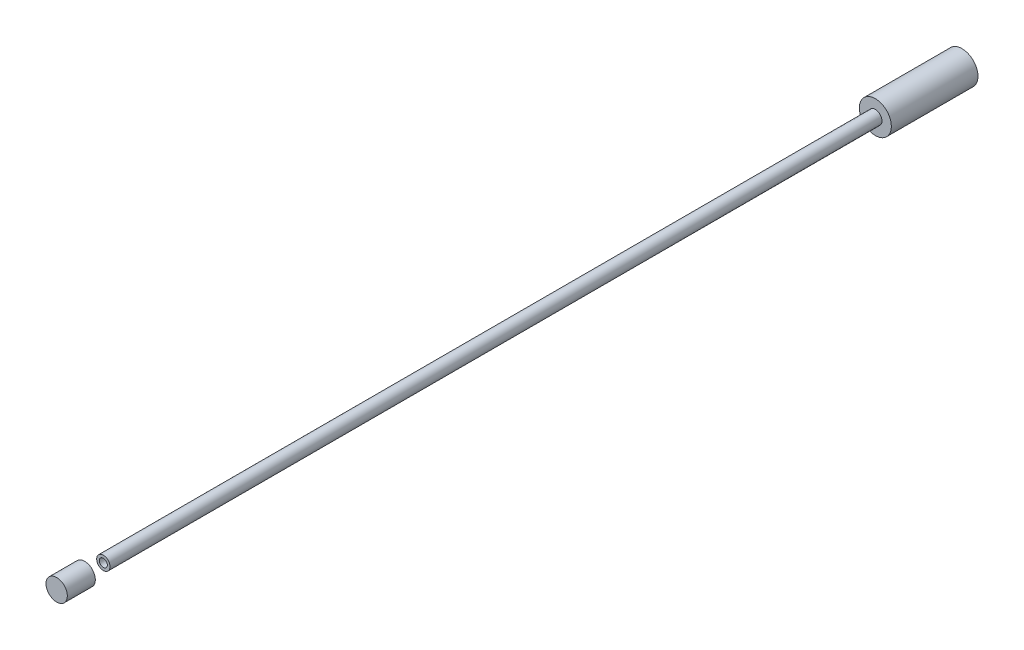
ISO-10303-21;
HEADER;
FILE_DESCRIPTION(('STEP AP214'),'2;1');
FILE_NAME('part.step','',(''),(''),'','','');
FILE_SCHEMA(('AUTOMOTIVE_DESIGN { 1 0 10303 214 1 1 1 1 }'));
ENDSEC;
DATA;
#1=APPLICATION_CONTEXT('core data for automotive mechanical design processes');
#2=APPLICATION_PROTOCOL_DEFINITION('international standard','automotive_design',2000,#1);
#3=PRODUCT_CONTEXT('',#1,'mechanical');
#4=PRODUCT('Part','Part','',(#3));
#5=PRODUCT_RELATED_PRODUCT_CATEGORY('part','',(#4));
#6=PRODUCT_DEFINITION_FORMATION('','',#4);
#7=PRODUCT_DEFINITION_CONTEXT('part definition',#1,'design');
#8=PRODUCT_DEFINITION('design','',#6,#7);
#9=PRODUCT_DEFINITION_SHAPE('','',#8);
#10=(LENGTH_UNIT() NAMED_UNIT(*) SI_UNIT(.MILLI.,.METRE.));
#11=(NAMED_UNIT(*) PLANE_ANGLE_UNIT() SI_UNIT($,.RADIAN.));
#12=(NAMED_UNIT(*) SI_UNIT($,.STERADIAN.) SOLID_ANGLE_UNIT());
#13=UNCERTAINTY_MEASURE_WITH_UNIT(LENGTH_MEASURE(1.E-05),#10,'distance_accuracy_value','');
#14=(GEOMETRIC_REPRESENTATION_CONTEXT(3) GLOBAL_UNCERTAINTY_ASSIGNED_CONTEXT((#13)) GLOBAL_UNIT_ASSIGNED_CONTEXT((#10,
#11,#12)) REPRESENTATION_CONTEXT('',''));
#15=CARTESIAN_POINT('',(0.,0.,0.));
#16=DIRECTION('',(0.,0.,1.));
#17=DIRECTION('',(1.,0.,0.));
#18=AXIS2_PLACEMENT_3D('',#15,#16,#17);
#19=CARTESIAN_POINT('',(285.,0.,344.));
#20=DIRECTION('',(0.,0.,-1.));
#21=DIRECTION('',(-1.,0.,0.));
#22=AXIS2_PLACEMENT_3D('',#19,#20,#21);
#23=CYLINDRICAL_SURFACE('',#22,8.00000000000001);
#24=CARTESIAN_POINT('',(285.,0.,344.));
#25=DIRECTION('',(0.,0.,1.));
#26=DIRECTION('',(1.,0.,0.));
#27=AXIS2_PLACEMENT_3D('',#24,#25,#26);
#28=CIRCLE('',#27,8.00000000000001);
#29=CARTESIAN_POINT('',(277.,0.,344.));
#30=VERTEX_POINT('',#29);
#31=EDGE_CURVE('E11',#30,#30,#28,.T.);
#32=CARTESIAN_POINT('',(285.,0.,323.));
#33=DIRECTION('',(0.,0.,1.));
#34=DIRECTION('',(1.,0.,0.));
#35=AXIS2_PLACEMENT_3D('',#32,#33,#34);
#36=CIRCLE('',#35,8.00000000000001);
#37=CARTESIAN_POINT('',(277.,0.,323.));
#38=VERTEX_POINT('',#37);
#39=EDGE_CURVE('E51',#38,#38,#36,.T.);
#40=CARTESIAN_POINT('',(277.,0.,344.));
#41=CARTESIAN_POINT('',(277.,0.,343.78125));
#42=CARTESIAN_POINT('',(277.,0.,343.5625));
#43=CARTESIAN_POINT('',(277.,0.,343.125));
#44=CARTESIAN_POINT('',(277.,0.,342.90625));
#45=CARTESIAN_POINT('',(277.,0.,342.46875));
#46=CARTESIAN_POINT('',(277.,0.,342.25));
#47=CARTESIAN_POINT('',(277.,0.,341.8125));
#48=CARTESIAN_POINT('',(277.,0.,341.59375));
#49=CARTESIAN_POINT('',(277.,0.,341.15625));
#50=CARTESIAN_POINT('',(277.,0.,340.9375));
#51=CARTESIAN_POINT('',(277.,0.,340.5));
#52=CARTESIAN_POINT('',(277.,0.,340.28125));
#53=CARTESIAN_POINT('',(277.,0.,339.84375));
#54=CARTESIAN_POINT('',(277.,0.,339.625));
#55=CARTESIAN_POINT('',(277.,0.,339.1875));
#56=CARTESIAN_POINT('',(277.,0.,338.96875));
#57=CARTESIAN_POINT('',(277.,0.,338.53125));
#58=CARTESIAN_POINT('',(277.,0.,338.3125));
#59=CARTESIAN_POINT('',(277.,0.,337.875));
#60=CARTESIAN_POINT('',(277.,0.,337.65625));
#61=CARTESIAN_POINT('',(277.,0.,337.21875));
#62=CARTESIAN_POINT('',(277.,0.,337.));
#63=CARTESIAN_POINT('',(277.,0.,336.5625));
#64=CARTESIAN_POINT('',(277.,0.,336.34375));
#65=CARTESIAN_POINT('',(277.,0.,335.90625));
#66=CARTESIAN_POINT('',(277.,0.,335.6875));
#67=CARTESIAN_POINT('',(277.,0.,335.25));
#68=CARTESIAN_POINT('',(277.,0.,335.03125));
#69=CARTESIAN_POINT('',(277.,0.,334.59375));
#70=CARTESIAN_POINT('',(277.,0.,334.375));
#71=CARTESIAN_POINT('',(277.,0.,333.9375));
#72=CARTESIAN_POINT('',(277.,0.,333.71875));
#73=CARTESIAN_POINT('',(277.,0.,333.28125));
#74=CARTESIAN_POINT('',(277.,0.,333.0625));
#75=CARTESIAN_POINT('',(277.,0.,332.625));
#76=CARTESIAN_POINT('',(277.,0.,332.40625));
#77=CARTESIAN_POINT('',(277.,0.,331.96875));
#78=CARTESIAN_POINT('',(277.,0.,331.75));
#79=CARTESIAN_POINT('',(277.,0.,331.3125));
#80=CARTESIAN_POINT('',(277.,0.,331.09375));
#81=CARTESIAN_POINT('',(277.,0.,330.65625));
#82=CARTESIAN_POINT('',(277.,0.,330.4375));
#83=CARTESIAN_POINT('',(277.,0.,330.));
#84=CARTESIAN_POINT('',(277.,0.,329.78125));
#85=CARTESIAN_POINT('',(277.,0.,329.34375));
#86=CARTESIAN_POINT('',(277.,0.,329.125));
#87=CARTESIAN_POINT('',(277.,0.,328.6875));
#88=CARTESIAN_POINT('',(277.,0.,328.46875));
#89=CARTESIAN_POINT('',(277.,0.,328.03125));
#90=CARTESIAN_POINT('',(277.,0.,327.8125));
#91=CARTESIAN_POINT('',(277.,0.,327.375));
#92=CARTESIAN_POINT('',(277.,0.,327.15625));
#93=CARTESIAN_POINT('',(277.,0.,326.71875));
#94=CARTESIAN_POINT('',(277.,0.,326.5));
#95=CARTESIAN_POINT('',(277.,0.,326.0625));
#96=CARTESIAN_POINT('',(277.,0.,325.84375));
#97=CARTESIAN_POINT('',(277.,0.,325.40625));
#98=CARTESIAN_POINT('',(277.,0.,325.1875));
#99=CARTESIAN_POINT('',(277.,0.,324.75));
#100=CARTESIAN_POINT('',(277.,0.,324.53125));
#101=CARTESIAN_POINT('',(277.,0.,324.09375));
#102=CARTESIAN_POINT('',(277.,0.,323.875));
#103=CARTESIAN_POINT('',(277.,0.,323.4375));
#104=CARTESIAN_POINT('',(277.,0.,323.21875));
#105=CARTESIAN_POINT('',(277.,0.,323.));
#106=B_SPLINE_CURVE_WITH_KNOTS('',3,(#40,#41,#42,#43,#44,#45,#46,#47,#48,#49,#50,#51,#52,#53,
#54,#55,#56,#57,#58,#59,#60,#61,#62,#63,#64,#65,#66,#67,#68,#69,#70,#71,#72,#73,#74,#75,#76,#77,
#78,#79,#80,#81,#82,#83,#84,#85,#86,#87,#88,#89,#90,#91,#92,#93,#94,#95,#96,#97,#98,#99,#100,
#101,#102,#103,#104,#105),.UNSPECIFIED.,.F.,.F.,(4,2,2,2,2,2,2,2,2,2,2,2,2,2,2,2,2,2,2,2,2,2,2,
2,2,2,2,2,2,2,2,2,4),(0.,0.656250000000025,1.31250000000005,1.96875000000002,2.62500000000004,
3.28125000000001,3.93750000000004,4.59375000000001,5.25000000000003,5.90625000000006,
6.56250000000003,7.21875000000005,7.87500000000002,8.53125000000005,9.18750000000001,
9.84375000000004,10.5,11.15625,11.8125000000001,12.46875,13.1250000000001,13.78125,14.4375,
15.09375,15.75,16.40625,17.0625,17.7187500000001,18.375,19.0312500000001,19.6875,20.34375,21.),.UNSPECIFIED.);
#107=EDGE_CURVE('BSEAM48',#30,#38,#106,.T.);
#108=ORIENTED_EDGE('',*,*,#31,.F.);
#109=ORIENTED_EDGE('',*,*,#39,.T.);
#110=ORIENTED_EDGE('',*,*,#107,.T.);
#111=ORIENTED_EDGE('',*,*,#107,.F.);
#112=EDGE_LOOP('',(#108,#110,#109,#111));
#113=FACE_BOUND('',#112,.T.);
#114=ADVANCED_FACE('F48',(#113),#23,.T.);
#115=CARTESIAN_POINT('',(285.,0.,344.));
#116=DIRECTION('',(0.,0.,1.));
#117=DIRECTION('',(1.,0.,0.));
#118=AXIS2_PLACEMENT_3D('',#115,#116,#117);
#119=PLANE('',#118);
#120=ORIENTED_EDGE('',*,*,#31,.T.);
#121=EDGE_LOOP('',(#120));
#122=FACE_BOUND('',#121,.T.);
#123=ADVANCED_FACE('F65',(#122),#119,.T.);
#124=CARTESIAN_POINT('',(285.,0.,323.));
#125=DIRECTION('',(0.,0.,1.));
#126=DIRECTION('',(1.,0.,0.));
#127=AXIS2_PLACEMENT_3D('',#124,#125,#126);
#128=PLANE('',#127);
#129=ORIENTED_EDGE('',*,*,#39,.F.);
#130=EDGE_LOOP('',(#129));
#131=FACE_BOUND('',#130,.T.);
#132=ADVANCED_FACE('F64',(#131),#128,.F.);
#133=CLOSED_SHELL('',(#114,#123,#132));
#134=MANIFOLD_SOLID_BREP('B2',#133);
#135=CARTESIAN_POINT('',(285.,0.,309.));
#136=DIRECTION('',(0.,0.,1.));
#137=DIRECTION('',(1.,0.,0.));
#138=AXIS2_PLACEMENT_3D('',#135,#136,#137);
#139=PLANE('',#138);
#140=CARTESIAN_POINT('',(285.,0.,309.));
#141=DIRECTION('',(0.,0.,1.));
#142=DIRECTION('',(1.,0.,0.));
#143=AXIS2_PLACEMENT_3D('',#140,#141,#142);
#144=CIRCLE('',#143,5.);
#145=CARTESIAN_POINT('',(290.,0.,309.));
#146=VERTEX_POINT('',#145);
#147=EDGE_CURVE('E50',#146,#146,#144,.T.);
#148=ORIENTED_EDGE('',*,*,#147,.T.);
#149=EDGE_LOOP('',(#148));
#150=FACE_BOUND('',#149,.T.);
#151=CARTESIAN_POINT('',(285.,0.,309.));
#152=DIRECTION('',(0.,0.,1.));
#153=DIRECTION('',(1.,0.,0.));
#154=AXIS2_PLACEMENT_3D('',#151,#152,#153);
#155=CIRCLE('',#154,3.);
#156=CARTESIAN_POINT('',(288.,0.,309.));
#157=VERTEX_POINT('',#156);
#158=EDGE_CURVE('E110',#157,#157,#155,.T.);
#159=ORIENTED_EDGE('',*,*,#158,.F.);
#160=EDGE_LOOP('',(#159));
#161=FACE_BOUND('',#160,.T.);
#162=ADVANCED_FACE('F96',(#150,#161),#139,.T.);
#163=CARTESIAN_POINT('',(285.,0.,-270.));
#164=DIRECTION('',(0.,0.,1.));
#165=DIRECTION('',(1.,0.,0.));
#166=AXIS2_PLACEMENT_3D('',#163,#164,#165);
#167=PLANE('',#166);
#168=CARTESIAN_POINT('',(285.,0.,-270.));
#169=DIRECTION('',(0.,0.,1.));
#170=DIRECTION('',(1.,0.,0.));
#171=AXIS2_PLACEMENT_3D('',#168,#169,#170);
#172=CIRCLE('',#171,5.);
#173=CARTESIAN_POINT('',(290.,0.,-270.));
#174=VERTEX_POINT('',#173);
#175=EDGE_CURVE('E99',#174,#174,#172,.T.);
#176=ORIENTED_EDGE('',*,*,#175,.F.);
#177=EDGE_LOOP('',(#176));
#178=FACE_BOUND('',#177,.T.);
#179=CARTESIAN_POINT('',(285.,0.,-270.));
#180=DIRECTION('',(0.,0.,1.));
#181=DIRECTION('',(1.,0.,0.));
#182=AXIS2_PLACEMENT_3D('',#179,#180,#181);
#183=CIRCLE('',#182,3.);
#184=CARTESIAN_POINT('',(288.,0.,-270.));
#185=VERTEX_POINT('',#184);
#186=EDGE_CURVE('E108',#185,#185,#183,.T.);
#187=ORIENTED_EDGE('',*,*,#186,.T.);
#188=EDGE_LOOP('',(#187));
#189=FACE_BOUND('',#188,.T.);
#190=ADVANCED_FACE('F118',(#178,#189),#167,.F.);
#191=CARTESIAN_POINT('',(285.,0.,309.));
#192=DIRECTION('',(0.,0.,-1.));
#193=DIRECTION('',(-1.,0.,0.));
#194=AXIS2_PLACEMENT_3D('',#191,#192,#193);
#195=CYLINDRICAL_SURFACE('',#194,5.);
#196=ORIENTED_EDGE('',*,*,#147,.F.);
#197=EDGE_LOOP('',(#196));
#198=FACE_BOUND('',#197,.T.);
#199=ORIENTED_EDGE('',*,*,#175,.T.);
#200=EDGE_LOOP('',(#199));
#201=FACE_BOUND('',#200,.T.);
#202=ADVANCED_FACE('F98',(#198,#201),#195,.T.);
#203=CARTESIAN_POINT('',(285.,0.,309.));
#204=DIRECTION('',(0.,0.,-1.));
#205=DIRECTION('',(-1.,0.,0.));
#206=AXIS2_PLACEMENT_3D('',#203,#204,#205);
#207=CYLINDRICAL_SURFACE('',#206,3.);
#208=ORIENTED_EDGE('',*,*,#158,.T.);
#209=EDGE_LOOP('',(#208));
#210=FACE_BOUND('',#209,.T.);
#211=ORIENTED_EDGE('',*,*,#186,.F.);
#212=EDGE_LOOP('',(#211));
#213=FACE_BOUND('',#212,.T.);
#214=ADVANCED_FACE('F113',(#210,#213),#207,.F.);
#215=CLOSED_SHELL('',(#162,#190,#202,#214));
#216=MANIFOLD_SOLID_BREP('B6',#215);
#217=CARTESIAN_POINT('',(285.,0.,-270.));
#218=DIRECTION('',(0.,0.,-1.));
#219=DIRECTION('',(-1.,0.,0.));
#220=AXIS2_PLACEMENT_3D('',#217,#218,#219);
#221=CYLINDRICAL_SURFACE('',#220,12.);
#222=CARTESIAN_POINT('',(285.,0.,-270.));
#223=DIRECTION('',(0.,0.,1.));
#224=DIRECTION('',(1.,0.,0.));
#225=AXIS2_PLACEMENT_3D('',#222,#223,#224);
#226=CIRCLE('',#225,12.);
#227=CARTESIAN_POINT('',(297.,0.,-270.));
#228=VERTEX_POINT('',#227);
#229=EDGE_CURVE('E92',#228,#228,#226,.T.);
#230=ORIENTED_EDGE('',*,*,#229,.F.);
#231=EDGE_LOOP('',(#230));
#232=FACE_BOUND('',#231,.T.);
#233=CARTESIAN_POINT('',(285.,0.,-335.));
#234=DIRECTION('',(0.,0.,1.));
#235=DIRECTION('',(1.,0.,0.));
#236=AXIS2_PLACEMENT_3D('',#233,#234,#235);
#237=CIRCLE('',#236,12.);
#238=CARTESIAN_POINT('',(297.,0.,-335.));
#239=VERTEX_POINT('',#238);
#240=EDGE_CURVE('E161',#239,#239,#237,.T.);
#241=ORIENTED_EDGE('',*,*,#240,.T.);
#242=EDGE_LOOP('',(#241));
#243=FACE_BOUND('',#242,.T.);
#244=ADVANCED_FACE('F158',(#232,#243),#221,.T.);
#245=CARTESIAN_POINT('',(285.,0.,-270.));
#246=DIRECTION('',(0.,0.,1.));
#247=DIRECTION('',(1.,0.,0.));
#248=AXIS2_PLACEMENT_3D('',#245,#246,#247);
#249=PLANE('',#248);
#250=ORIENTED_EDGE('',*,*,#229,.T.);
#251=EDGE_LOOP('',(#250));
#252=FACE_BOUND('',#251,.T.);
#253=ADVANCED_FACE('F175',(#252),#249,.T.);
#254=CARTESIAN_POINT('',(285.,0.,-335.));
#255=DIRECTION('',(0.,0.,1.));
#256=DIRECTION('',(1.,0.,0.));
#257=AXIS2_PLACEMENT_3D('',#254,#255,#256);
#258=PLANE('',#257);
#259=ORIENTED_EDGE('',*,*,#240,.F.);
#260=EDGE_LOOP('',(#259));
#261=FACE_BOUND('',#260,.T.);
#262=ADVANCED_FACE('F174',(#261),#258,.F.);
#263=CLOSED_SHELL('',(#244,#253,#262));
#264=MANIFOLD_SOLID_BREP('B45',#263);
#265=ADVANCED_BREP_SHAPE_REPRESENTATION('',(#18,#134,#216,#264),#14);
#266=SHAPE_DEFINITION_REPRESENTATION(#9,#265);
ENDSEC;
END-ISO-10303-21;
